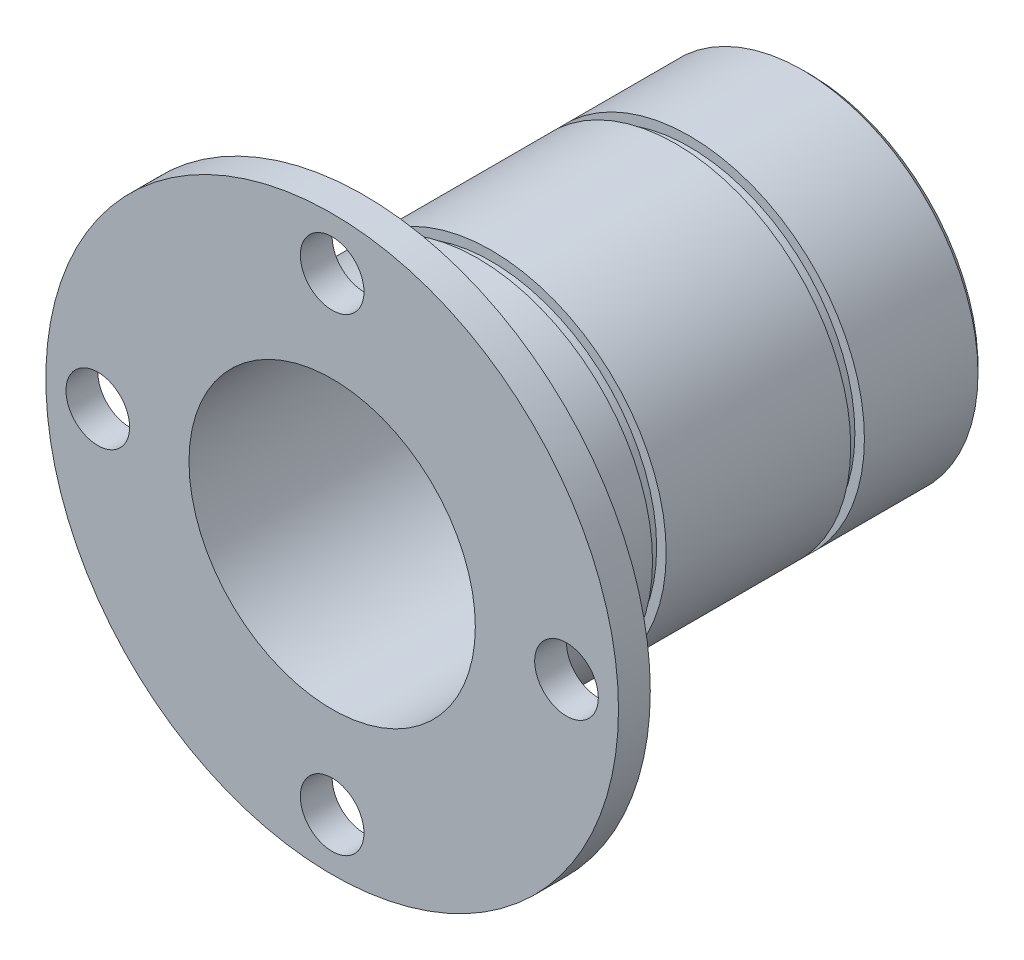
ISO-10303-21;
HEADER;
FILE_DESCRIPTION(('STEP AP214'),'2;1');
FILE_NAME('part.step','',(''),(''),'','','');
FILE_SCHEMA(('AUTOMOTIVE_DESIGN { 1 0 10303 214 1 1 1 1 }'));
ENDSEC;
DATA;
#1=APPLICATION_CONTEXT('core data for automotive mechanical design processes');
#2=APPLICATION_PROTOCOL_DEFINITION('international standard','automotive_design',2000,#1);
#3=PRODUCT_CONTEXT('',#1,'mechanical');
#4=PRODUCT('Part','Part','',(#3));
#5=PRODUCT_RELATED_PRODUCT_CATEGORY('part','',(#4));
#6=PRODUCT_DEFINITION_FORMATION('','',#4);
#7=PRODUCT_DEFINITION_CONTEXT('part definition',#1,'design');
#8=PRODUCT_DEFINITION('design','',#6,#7);
#9=PRODUCT_DEFINITION_SHAPE('','',#8);
#10=(LENGTH_UNIT() NAMED_UNIT(*) SI_UNIT(.MILLI.,.METRE.));
#11=(NAMED_UNIT(*) PLANE_ANGLE_UNIT() SI_UNIT($,.RADIAN.));
#12=(NAMED_UNIT(*) SI_UNIT($,.STERADIAN.) SOLID_ANGLE_UNIT());
#13=UNCERTAINTY_MEASURE_WITH_UNIT(LENGTH_MEASURE(1.E-05),#10,'distance_accuracy_value','');
#14=(GEOMETRIC_REPRESENTATION_CONTEXT(3) GLOBAL_UNCERTAINTY_ASSIGNED_CONTEXT((#13)) GLOBAL_UNIT_ASSIGNED_CONTEXT((#10,
#11,#12)) REPRESENTATION_CONTEXT('',''));
#15=CARTESIAN_POINT('',(0.,0.,0.));
#16=DIRECTION('',(0.,0.,1.));
#17=DIRECTION('',(1.,0.,0.));
#18=AXIS2_PLACEMENT_3D('',#15,#16,#17);
#19=CARTESIAN_POINT('',(0.,0.,-70.));
#20=DIRECTION('',(0.,0.,1.));
#21=DIRECTION('',(1.,0.,0.));
#22=AXIS2_PLACEMENT_3D('',#19,#20,#21);
#23=CYLINDRICAL_SURFACE('',#22,27.5);
#24=CARTESIAN_POINT('',(0.,0.,-69.));
#25=DIRECTION('',(0.,0.,-1.));
#26=DIRECTION('',(-1.,0.,0.));
#27=AXIS2_PLACEMENT_3D('',#24,#25,#26);
#28=CIRCLE('',#27,27.5);
#29=CARTESIAN_POINT('',(-27.5,0.,-69.));
#30=VERTEX_POINT('',#29);
#31=EDGE_CURVE('E10',#30,#30,#28,.F.);
#32=ORIENTED_EDGE('',*,*,#31,.T.);
#33=EDGE_LOOP('',(#32));
#34=FACE_BOUND('',#33,.T.);
#35=CARTESIAN_POINT('',(0.,0.,-51.15));
#36=DIRECTION('',(0.,0.,1.));
#37=DIRECTION('',(1.,0.,0.));
#38=AXIS2_PLACEMENT_3D('',#35,#36,#37);
#39=CIRCLE('',#38,27.5);
#40=CARTESIAN_POINT('',(27.5,0.,-51.15));
#41=VERTEX_POINT('',#40);
#42=EDGE_CURVE('E48',#41,#41,#39,.T.);
#43=ORIENTED_EDGE('',*,*,#42,.F.);
#44=EDGE_LOOP('',(#43));
#45=FACE_BOUND('',#44,.T.);
#46=ADVANCED_FACE('F30',(#34,#45),#23,.T.);
#47=CARTESIAN_POINT('',(0.,0.,-20.));
#48=DIRECTION('',(0.,0.,1.));
#49=DIRECTION('',(1.,0.,0.));
#50=AXIS2_PLACEMENT_3D('',#47,#48,#49);
#51=CIRCLE('',#50,27.5);
#52=CARTESIAN_POINT('',(27.5,0.,-20.));
#53=VERTEX_POINT('',#52);
#54=EDGE_CURVE('E56',#53,#53,#51,.T.);
#55=ORIENTED_EDGE('',*,*,#54,.F.);
#56=EDGE_LOOP('',(#55));
#57=FACE_BOUND('',#56,.T.);
#58=CARTESIAN_POINT('',(0.,0.,-49.));
#59=DIRECTION('',(0.,0.,-1.));
#60=DIRECTION('',(-1.,0.,0.));
#61=AXIS2_PLACEMENT_3D('',#58,#59,#60);
#62=CIRCLE('',#61,27.5);
#63=CARTESIAN_POINT('',(-27.5,0.,-49.));
#64=VERTEX_POINT('',#63);
#65=EDGE_CURVE('E52',#64,#64,#62,.T.);
#66=ORIENTED_EDGE('',*,*,#65,.F.);
#67=EDGE_LOOP('',(#66));
#68=FACE_BOUND('',#67,.T.);
#69=ADVANCED_FACE('F120',(#57,#68),#23,.T.);
#70=CARTESIAN_POINT('',(0.,0.,0.));
#71=DIRECTION('',(0.,0.,1.));
#72=DIRECTION('',(1.,0.,0.));
#73=AXIS2_PLACEMENT_3D('',#70,#71,#72);
#74=CIRCLE('',#73,27.5);
#75=CARTESIAN_POINT('',(27.5,0.,0.));
#76=VERTEX_POINT('',#75);
#77=EDGE_CURVE('E41',#76,#76,#74,.F.);
#78=ORIENTED_EDGE('',*,*,#77,.T.);
#79=EDGE_LOOP('',(#78));
#80=FACE_BOUND('',#79,.T.);
#81=CARTESIAN_POINT('',(0.,0.,-17.85));
#82=DIRECTION('',(0.,0.,-1.));
#83=DIRECTION('',(-1.,0.,0.));
#84=AXIS2_PLACEMENT_3D('',#81,#82,#83);
#85=CIRCLE('',#84,27.5);
#86=CARTESIAN_POINT('',(-27.5,0.,-17.85));
#87=VERTEX_POINT('',#86);
#88=EDGE_CURVE('E60',#87,#87,#85,.T.);
#89=ORIENTED_EDGE('',*,*,#88,.F.);
#90=EDGE_LOOP('',(#89));
#91=FACE_BOUND('',#90,.T.);
#92=ADVANCED_FACE('F122',(#80,#91),#23,.T.);
#93=CARTESIAN_POINT('',(0.,0.,0.));
#94=DIRECTION('',(0.,0.,1.));
#95=DIRECTION('',(1.,0.,0.));
#96=AXIS2_PLACEMENT_3D('',#93,#94,#95);
#97=PLANE('',#96);
#98=CARTESIAN_POINT('',(-36.829999999999,-1.04677155832178E-12,0.));
#99=DIRECTION('',(0.,0.,1.));
#100=DIRECTION('',(1.,0.,0.));
#101=AXIS2_PLACEMENT_3D('',#98,#99,#100);
#102=CIRCLE('',#101,5.00000000000168);
#103=CARTESIAN_POINT('',(-31.8299999999973,-1.04677155832178E-12,0.));
#104=VERTEX_POINT('',#103);
#105=EDGE_CURVE('E91',#104,#104,#102,.T.);
#106=ORIENTED_EDGE('',*,*,#105,.T.);
#107=EDGE_LOOP('',(#106));
#108=FACE_BOUND('',#107,.T.);
#109=CARTESIAN_POINT('',(36.830000000001,1.04226118416052E-12,0.));
#110=DIRECTION('',(0.,0.,1.));
#111=DIRECTION('',(1.,0.,0.));
#112=AXIS2_PLACEMENT_3D('',#109,#110,#111);
#113=CIRCLE('',#112,5.00000000000081);
#114=CARTESIAN_POINT('',(41.8300000000019,1.04226118416052E-12,0.));
#115=VERTEX_POINT('',#114);
#116=EDGE_CURVE('E79',#115,#115,#113,.T.);
#117=ORIENTED_EDGE('',*,*,#116,.T.);
#118=EDGE_LOOP('',(#117));
#119=FACE_BOUND('',#118,.T.);
#120=CARTESIAN_POINT('',(0.,0.,0.));
#121=DIRECTION('',(0.,0.,1.));
#122=DIRECTION('',(1.,0.,0.));
#123=AXIS2_PLACEMENT_3D('',#120,#121,#122);
#124=CIRCLE('',#123,45.);
#125=CARTESIAN_POINT('',(45.,0.,0.));
#126=VERTEX_POINT('',#125);
#127=EDGE_CURVE('E64',#126,#126,#124,.T.);
#128=ORIENTED_EDGE('',*,*,#127,.F.);
#129=EDGE_LOOP('',(#128));
#130=FACE_BOUND('',#129,.T.);
#131=CARTESIAN_POINT('',(0.,36.83,0.));
#132=DIRECTION('',(0.,0.,1.));
#133=DIRECTION('',(1.,0.,0.));
#134=AXIS2_PLACEMENT_3D('',#131,#132,#133);
#135=CIRCLE('',#134,5.);
#136=CARTESIAN_POINT('',(5.,36.83,0.));
#137=VERTEX_POINT('',#136);
#138=EDGE_CURVE('E73',#137,#137,#135,.T.);
#139=ORIENTED_EDGE('',*,*,#138,.T.);
#140=EDGE_LOOP('',(#139));
#141=FACE_BOUND('',#140,.T.);
#142=CARTESIAN_POINT('',(2.08452236832104E-12,-36.83,0.));
#143=DIRECTION('',(0.,0.,1.));
#144=DIRECTION('',(1.,0.,0.));
#145=AXIS2_PLACEMENT_3D('',#142,#143,#144);
#146=CIRCLE('',#145,5.00000000000224);
#147=CARTESIAN_POINT('',(5.00000000000432,-36.83,0.));
#148=VERTEX_POINT('',#147);
#149=EDGE_CURVE('E85',#148,#148,#146,.T.);
#150=ORIENTED_EDGE('',*,*,#149,.T.);
#151=EDGE_LOOP('',(#150));
#152=FACE_BOUND('',#151,.T.);
#153=ORIENTED_EDGE('',*,*,#77,.F.);
#154=EDGE_LOOP('',(#153));
#155=FACE_BOUND('',#154,.T.);
#156=ADVANCED_FACE('F130',(#108,#119,#130,#141,#152,#155),#97,.F.);
#157=CARTESIAN_POINT('',(0.,0.,5.));
#158=DIRECTION('',(0.,0.,1.));
#159=DIRECTION('',(1.,0.,0.));
#160=AXIS2_PLACEMENT_3D('',#157,#158,#159);
#161=PLANE('',#160);
#162=CARTESIAN_POINT('',(2.08452236832104E-12,-36.83,5.));
#163=DIRECTION('',(0.,0.,1.));
#164=DIRECTION('',(1.,0.,0.));
#165=AXIS2_PLACEMENT_3D('',#162,#163,#164);
#166=CIRCLE('',#165,5.00000000000224);
#167=CARTESIAN_POINT('',(5.00000000000432,-36.83,5.));
#168=VERTEX_POINT('',#167);
#169=EDGE_CURVE('E82',#168,#168,#166,.T.);
#170=ORIENTED_EDGE('',*,*,#169,.F.);
#171=EDGE_LOOP('',(#170));
#172=FACE_BOUND('',#171,.T.);
#173=CARTESIAN_POINT('',(0.,36.83,5.));
#174=DIRECTION('',(0.,0.,1.));
#175=DIRECTION('',(1.,0.,0.));
#176=AXIS2_PLACEMENT_3D('',#173,#174,#175);
#177=CIRCLE('',#176,5.);
#178=CARTESIAN_POINT('',(5.,36.83,5.));
#179=VERTEX_POINT('',#178);
#180=EDGE_CURVE('E72',#179,#179,#177,.T.);
#181=ORIENTED_EDGE('',*,*,#180,.F.);
#182=EDGE_LOOP('',(#181));
#183=FACE_BOUND('',#182,.T.);
#184=CARTESIAN_POINT('',(0.,0.,5.));
#185=DIRECTION('',(0.,0.,1.));
#186=DIRECTION('',(1.,0.,0.));
#187=AXIS2_PLACEMENT_3D('',#184,#185,#186);
#188=CIRCLE('',#187,45.);
#189=CARTESIAN_POINT('',(45.,0.,5.));
#190=VERTEX_POINT('',#189);
#191=EDGE_CURVE('E45',#190,#190,#188,.T.);
#192=ORIENTED_EDGE('',*,*,#191,.T.);
#193=EDGE_LOOP('',(#192));
#194=FACE_BOUND('',#193,.T.);
#195=CARTESIAN_POINT('',(0.,0.,5.));
#196=DIRECTION('',(0.,0.,1.));
#197=DIRECTION('',(1.,0.,0.));
#198=AXIS2_PLACEMENT_3D('',#195,#196,#197);
#199=CIRCLE('',#198,22.5);
#200=CARTESIAN_POINT('',(22.5,0.,5.));
#201=VERTEX_POINT('',#200);
#202=EDGE_CURVE('E67',#201,#201,#199,.T.);
#203=ORIENTED_EDGE('',*,*,#202,.F.);
#204=EDGE_LOOP('',(#203));
#205=FACE_BOUND('',#204,.T.);
#206=CARTESIAN_POINT('',(36.830000000001,1.04226118416052E-12,5.));
#207=DIRECTION('',(0.,0.,1.));
#208=DIRECTION('',(1.,0.,0.));
#209=AXIS2_PLACEMENT_3D('',#206,#207,#208);
#210=CIRCLE('',#209,5.00000000000081);
#211=CARTESIAN_POINT('',(41.8300000000019,1.04226118416052E-12,5.));
#212=VERTEX_POINT('',#211);
#213=EDGE_CURVE('E76',#212,#212,#210,.T.);
#214=ORIENTED_EDGE('',*,*,#213,.F.);
#215=EDGE_LOOP('',(#214));
#216=FACE_BOUND('',#215,.T.);
#217=CARTESIAN_POINT('',(-36.829999999999,-1.04677155832178E-12,5.));
#218=DIRECTION('',(0.,0.,1.));
#219=DIRECTION('',(1.,0.,0.));
#220=AXIS2_PLACEMENT_3D('',#217,#218,#219);
#221=CIRCLE('',#220,5.00000000000168);
#222=CARTESIAN_POINT('',(-31.8299999999973,-1.04677155832178E-12,5.));
#223=VERTEX_POINT('',#222);
#224=EDGE_CURVE('E88',#223,#223,#221,.T.);
#225=ORIENTED_EDGE('',*,*,#224,.F.);
#226=EDGE_LOOP('',(#225));
#227=FACE_BOUND('',#226,.T.);
#228=ADVANCED_FACE('F135',(#172,#183,#194,#205,#216,#227),#161,.T.);
#229=CARTESIAN_POINT('',(0.,0.,5.));
#230=DIRECTION('',(0.,0.,-1.));
#231=DIRECTION('',(-1.,0.,0.));
#232=AXIS2_PLACEMENT_3D('',#229,#230,#231);
#233=CYLINDRICAL_SURFACE('',#232,45.);
#234=ORIENTED_EDGE('',*,*,#191,.F.);
#235=EDGE_LOOP('',(#234));
#236=FACE_BOUND('',#235,.T.);
#237=ORIENTED_EDGE('',*,*,#127,.T.);
#238=EDGE_LOOP('',(#237));
#239=FACE_BOUND('',#238,.T.);
#240=ADVANCED_FACE('F169',(#236,#239),#233,.T.);
#241=CARTESIAN_POINT('',(0.,0.,5.));
#242=DIRECTION('',(0.,0.,-1.));
#243=DIRECTION('',(-1.,0.,0.));
#244=AXIS2_PLACEMENT_3D('',#241,#242,#243);
#245=CYLINDRICAL_SURFACE('',#244,22.5);
#246=ORIENTED_EDGE('',*,*,#202,.T.);
#247=EDGE_LOOP('',(#246));
#248=FACE_BOUND('',#247,.T.);
#249=CARTESIAN_POINT('',(0.,0.,-70.));
#250=DIRECTION('',(0.,0.,-1.));
#251=DIRECTION('',(-1.,0.,0.));
#252=AXIS2_PLACEMENT_3D('',#249,#250,#251);
#253=CIRCLE('',#252,22.5);
#254=CARTESIAN_POINT('',(-22.5,0.,-70.));
#255=VERTEX_POINT('',#254);
#256=EDGE_CURVE('E59',#255,#255,#253,.T.);
#257=ORIENTED_EDGE('',*,*,#256,.T.);
#258=EDGE_LOOP('',(#257));
#259=FACE_BOUND('',#258,.T.);
#260=ADVANCED_FACE('F166',(#248,#259),#245,.F.);
#261=CARTESIAN_POINT('',(0.,36.83,5.));
#262=DIRECTION('',(0.,0.,-1.));
#263=DIRECTION('',(-1.,0.,0.));
#264=AXIS2_PLACEMENT_3D('',#261,#262,#263);
#265=CYLINDRICAL_SURFACE('',#264,5.);
#266=ORIENTED_EDGE('',*,*,#180,.T.);
#267=EDGE_LOOP('',(#266));
#268=FACE_BOUND('',#267,.T.);
#269=ORIENTED_EDGE('',*,*,#138,.F.);
#270=EDGE_LOOP('',(#269));
#271=FACE_BOUND('',#270,.T.);
#272=ADVANCED_FACE('F168',(#268,#271),#265,.F.);
#273=CARTESIAN_POINT('',(36.830000000001,1.04226118416052E-12,5.));
#274=DIRECTION('',(0.,0.,-1.));
#275=DIRECTION('',(-1.,0.,0.));
#276=AXIS2_PLACEMENT_3D('',#273,#274,#275);
#277=CYLINDRICAL_SURFACE('',#276,5.00000000000081);
#278=ORIENTED_EDGE('',*,*,#213,.T.);
#279=EDGE_LOOP('',(#278));
#280=FACE_BOUND('',#279,.T.);
#281=ORIENTED_EDGE('',*,*,#116,.F.);
#282=EDGE_LOOP('',(#281));
#283=FACE_BOUND('',#282,.T.);
#284=ADVANCED_FACE('F176',(#280,#283),#277,.F.);
#285=CARTESIAN_POINT('',(2.08452236832104E-12,-36.83,5.));
#286=DIRECTION('',(0.,0.,-1.));
#287=DIRECTION('',(-1.,0.,0.));
#288=AXIS2_PLACEMENT_3D('',#285,#286,#287);
#289=CYLINDRICAL_SURFACE('',#288,5.00000000000224);
#290=ORIENTED_EDGE('',*,*,#169,.T.);
#291=EDGE_LOOP('',(#290));
#292=FACE_BOUND('',#291,.T.);
#293=ORIENTED_EDGE('',*,*,#149,.F.);
#294=EDGE_LOOP('',(#293));
#295=FACE_BOUND('',#294,.T.);
#296=ADVANCED_FACE('F161',(#292,#295),#289,.F.);
#297=CARTESIAN_POINT('',(-36.829999999999,-1.04677155832178E-12,5.));
#298=DIRECTION('',(0.,0.,-1.));
#299=DIRECTION('',(-1.,0.,0.));
#300=AXIS2_PLACEMENT_3D('',#297,#298,#299);
#301=CYLINDRICAL_SURFACE('',#300,5.00000000000168);
#302=ORIENTED_EDGE('',*,*,#224,.T.);
#303=EDGE_LOOP('',(#302));
#304=FACE_BOUND('',#303,.T.);
#305=ORIENTED_EDGE('',*,*,#105,.F.);
#306=EDGE_LOOP('',(#305));
#307=FACE_BOUND('',#306,.T.);
#308=ADVANCED_FACE('F157',(#304,#307),#301,.F.);
#309=CARTESIAN_POINT('',(0.,0.,-70.));
#310=DIRECTION('',(0.,0.,-1.));
#311=DIRECTION('',(-1.,0.,0.));
#312=AXIS2_PLACEMENT_3D('',#309,#310,#311);
#313=PLANE('',#312);
#314=CARTESIAN_POINT('',(0.,0.,-70.));
#315=DIRECTION('',(0.,0.,-1.));
#316=DIRECTION('',(-1.,0.,0.));
#317=AXIS2_PLACEMENT_3D('',#314,#315,#316);
#318=CIRCLE('',#317,26.5);
#319=CARTESIAN_POINT('',(-26.5,0.,-70.));
#320=VERTEX_POINT('',#319);
#321=EDGE_CURVE('E37',#320,#320,#318,.T.);
#322=ORIENTED_EDGE('',*,*,#321,.T.);
#323=EDGE_LOOP('',(#322));
#324=FACE_BOUND('',#323,.T.);
#325=ORIENTED_EDGE('',*,*,#256,.F.);
#326=EDGE_LOOP('',(#325));
#327=FACE_BOUND('',#326,.T.);
#328=ADVANCED_FACE('F153',(#324,#327),#313,.T.);
#329=CARTESIAN_POINT('',(0.,0.,-20.));
#330=DIRECTION('',(0.,0.,1.));
#331=DIRECTION('',(1.,0.,0.));
#332=AXIS2_PLACEMENT_3D('',#329,#330,#331);
#333=PLANE('',#332);
#334=CARTESIAN_POINT('',(0.,0.,-20.));
#335=DIRECTION('',(0.,0.,1.));
#336=DIRECTION('',(1.,0.,0.));
#337=AXIS2_PLACEMENT_3D('',#334,#335,#336);
#338=CIRCLE('',#337,26.);
#339=CARTESIAN_POINT('',(26.,0.,-20.));
#340=VERTEX_POINT('',#339);
#341=EDGE_CURVE('E62',#340,#340,#338,.T.);
#342=ORIENTED_EDGE('',*,*,#341,.F.);
#343=EDGE_LOOP('',(#342));
#344=FACE_BOUND('',#343,.T.);
#345=ORIENTED_EDGE('',*,*,#54,.T.);
#346=EDGE_LOOP('',(#345));
#347=FACE_BOUND('',#346,.T.);
#348=ADVANCED_FACE('F144',(#344,#347),#333,.T.);
#349=CARTESIAN_POINT('',(0.,0.,-17.85));
#350=DIRECTION('',(0.,0.,-1.));
#351=DIRECTION('',(-1.,0.,0.));
#352=AXIS2_PLACEMENT_3D('',#349,#350,#351);
#353=PLANE('',#352);
#354=CARTESIAN_POINT('',(0.,0.,-17.85));
#355=DIRECTION('',(0.,0.,1.));
#356=DIRECTION('',(1.,0.,0.));
#357=AXIS2_PLACEMENT_3D('',#354,#355,#356);
#358=CIRCLE('',#357,26.);
#359=CARTESIAN_POINT('',(26.,0.,-17.85));
#360=VERTEX_POINT('',#359);
#361=EDGE_CURVE('E51',#360,#360,#358,.T.);
#362=ORIENTED_EDGE('',*,*,#361,.T.);
#363=EDGE_LOOP('',(#362));
#364=FACE_BOUND('',#363,.T.);
#365=ORIENTED_EDGE('',*,*,#88,.T.);
#366=EDGE_LOOP('',(#365));
#367=FACE_BOUND('',#366,.T.);
#368=ADVANCED_FACE('F142',(#364,#367),#353,.T.);
#369=CARTESIAN_POINT('',(0.,0.,0.));
#370=DIRECTION('',(0.,0.,1.));
#371=DIRECTION('',(1.,0.,0.));
#372=AXIS2_PLACEMENT_3D('',#369,#370,#371);
#373=CYLINDRICAL_SURFACE('',#372,26.);
#374=ORIENTED_EDGE('',*,*,#341,.T.);
#375=EDGE_LOOP('',(#374));
#376=FACE_BOUND('',#375,.T.);
#377=ORIENTED_EDGE('',*,*,#361,.F.);
#378=EDGE_LOOP('',(#377));
#379=FACE_BOUND('',#378,.T.);
#380=ADVANCED_FACE('F115',(#376,#379),#373,.T.);
#381=CARTESIAN_POINT('',(26.,0.,-51.15));
#382=DIRECTION('',(0.,0.,1.));
#383=DIRECTION('',(1.,0.,0.));
#384=AXIS2_PLACEMENT_3D('',#381,#382,#383);
#385=PLANE('',#384);
#386=CARTESIAN_POINT('',(0.,0.,-51.15));
#387=DIRECTION('',(0.,0.,1.));
#388=DIRECTION('',(1.,0.,0.));
#389=AXIS2_PLACEMENT_3D('',#386,#387,#388);
#390=CIRCLE('',#389,26.);
#391=CARTESIAN_POINT('',(26.,0.,-51.15));
#392=VERTEX_POINT('',#391);
#393=EDGE_CURVE('E104',#392,#392,#390,.T.);
#394=ORIENTED_EDGE('',*,*,#393,.F.);
#395=EDGE_LOOP('',(#394));
#396=FACE_BOUND('',#395,.T.);
#397=ORIENTED_EDGE('',*,*,#42,.T.);
#398=EDGE_LOOP('',(#397));
#399=FACE_BOUND('',#398,.T.);
#400=ADVANCED_FACE('F111',(#396,#399),#385,.T.);
#401=CARTESIAN_POINT('',(27.5,0.,-49.));
#402=DIRECTION('',(0.,0.,-1.));
#403=DIRECTION('',(-1.,0.,0.));
#404=AXIS2_PLACEMENT_3D('',#401,#402,#403);
#405=PLANE('',#404);
#406=CARTESIAN_POINT('',(0.,0.,-49.));
#407=DIRECTION('',(0.,0.,1.));
#408=DIRECTION('',(1.,0.,0.));
#409=AXIS2_PLACEMENT_3D('',#406,#407,#408);
#410=CIRCLE('',#409,26.);
#411=CARTESIAN_POINT('',(26.,0.,-49.));
#412=VERTEX_POINT('',#411);
#413=EDGE_CURVE('E55',#412,#412,#410,.T.);
#414=ORIENTED_EDGE('',*,*,#413,.T.);
#415=EDGE_LOOP('',(#414));
#416=FACE_BOUND('',#415,.T.);
#417=ORIENTED_EDGE('',*,*,#65,.T.);
#418=EDGE_LOOP('',(#417));
#419=FACE_BOUND('',#418,.T.);
#420=ADVANCED_FACE('F114',(#416,#419),#405,.T.);
#421=CARTESIAN_POINT('',(0.,0.,0.));
#422=DIRECTION('',(0.,0.,1.));
#423=DIRECTION('',(1.,0.,0.));
#424=AXIS2_PLACEMENT_3D('',#421,#422,#423);
#425=CYLINDRICAL_SURFACE('',#424,26.);
#426=ORIENTED_EDGE('',*,*,#393,.T.);
#427=EDGE_LOOP('',(#426));
#428=FACE_BOUND('',#427,.T.);
#429=ORIENTED_EDGE('',*,*,#413,.F.);
#430=EDGE_LOOP('',(#429));
#431=FACE_BOUND('',#430,.T.);
#432=ADVANCED_FACE('F108',(#428,#431),#425,.T.);
#433=CARTESIAN_POINT('',(0.,0.,-70.));
#434=DIRECTION('',(0.,0.,1.));
#435=DIRECTION('',(1.,0.,0.));
#436=AXIS2_PLACEMENT_3D('',#433,#434,#435);
#437=CONICAL_SURFACE('',#436,26.5,0.785398163397457);
#438=ORIENTED_EDGE('',*,*,#31,.F.);
#439=EDGE_LOOP('',(#438));
#440=FACE_BOUND('',#439,.T.);
#441=ORIENTED_EDGE('',*,*,#321,.F.);
#442=EDGE_LOOP('',(#441));
#443=FACE_BOUND('',#442,.T.);
#444=ADVANCED_FACE('F32',(#440,#443),#437,.T.);
#445=CLOSED_SHELL('',(#46,#69,#92,#156,#228,#240,#260,#272,#284,#296,#308,#328,#348,#368,#380,
#400,#420,#432,#444));
#446=MANIFOLD_SOLID_BREP('B2',#445);
#447=ADVANCED_BREP_SHAPE_REPRESENTATION('',(#18,#446),#14);
#448=SHAPE_DEFINITION_REPRESENTATION(#9,#447);
ENDSEC;
END-ISO-10303-21;
